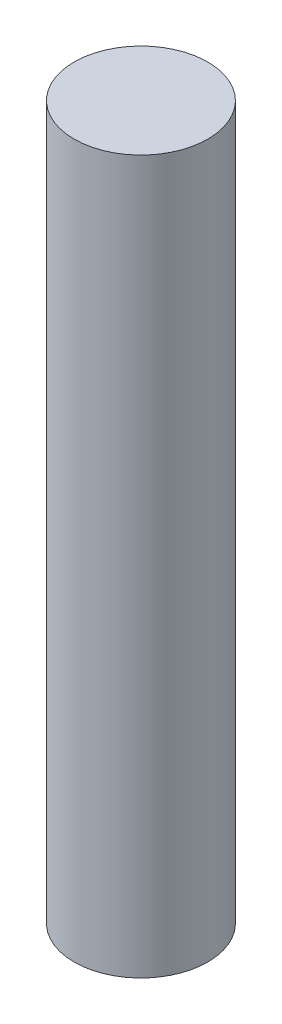
ISO-10303-21;
HEADER;
FILE_DESCRIPTION(('STEP AP214'),'2;1');
FILE_NAME('part.step','',(''),(''),'','','');
FILE_SCHEMA(('AUTOMOTIVE_DESIGN { 1 0 10303 214 1 1 1 1 }'));
ENDSEC;
DATA;
#1=APPLICATION_CONTEXT('core data for automotive mechanical design processes');
#2=APPLICATION_PROTOCOL_DEFINITION('international standard','automotive_design',2000,#1);
#3=PRODUCT_CONTEXT('',#1,'mechanical');
#4=PRODUCT('Part','Part','',(#3));
#5=PRODUCT_RELATED_PRODUCT_CATEGORY('part','',(#4));
#6=PRODUCT_DEFINITION_FORMATION('','',#4);
#7=PRODUCT_DEFINITION_CONTEXT('part definition',#1,'design');
#8=PRODUCT_DEFINITION('design','',#6,#7);
#9=PRODUCT_DEFINITION_SHAPE('','',#8);
#10=(LENGTH_UNIT() NAMED_UNIT(*) SI_UNIT(.MILLI.,.METRE.));
#11=(NAMED_UNIT(*) PLANE_ANGLE_UNIT() SI_UNIT($,.RADIAN.));
#12=(NAMED_UNIT(*) SI_UNIT($,.STERADIAN.) SOLID_ANGLE_UNIT());
#13=UNCERTAINTY_MEASURE_WITH_UNIT(LENGTH_MEASURE(1.E-05),#10,'distance_accuracy_value','');
#14=(GEOMETRIC_REPRESENTATION_CONTEXT(3) GLOBAL_UNCERTAINTY_ASSIGNED_CONTEXT((#13)) GLOBAL_UNIT_ASSIGNED_CONTEXT((#10,
#11,#12)) REPRESENTATION_CONTEXT('',''));
#15=CARTESIAN_POINT('',(0.,0.,0.));
#16=DIRECTION('',(0.,0.,1.));
#17=DIRECTION('',(1.,0.,0.));
#18=AXIS2_PLACEMENT_3D('',#15,#16,#17);
#19=CARTESIAN_POINT('',(0.,32.,0.));
#20=DIRECTION('',(0.,-1.,0.));
#21=DIRECTION('',(0.,0.,-1.));
#22=AXIS2_PLACEMENT_3D('',#19,#20,#21);
#23=CYLINDRICAL_SURFACE('',#22,3.);
#24=CARTESIAN_POINT('',(0.,32.,0.));
#25=DIRECTION('',(0.,1.,0.));
#26=DIRECTION('',(0.,0.,1.));
#27=AXIS2_PLACEMENT_3D('',#24,#25,#26);
#28=CIRCLE('',#27,3.);
#29=CARTESIAN_POINT('',(0.,32.,3.));
#30=VERTEX_POINT('',#29);
#31=EDGE_CURVE('E10',#30,#30,#28,.T.);
#32=ORIENTED_EDGE('',*,*,#31,.F.);
#33=EDGE_LOOP('',(#32));
#34=FACE_BOUND('',#33,.T.);
#35=CARTESIAN_POINT('',(0.,0.,0.));
#36=DIRECTION('',(0.,1.,0.));
#37=DIRECTION('',(0.,0.,1.));
#38=AXIS2_PLACEMENT_3D('',#35,#36,#37);
#39=CIRCLE('',#38,3.);
#40=CARTESIAN_POINT('',(0.,0.,3.));
#41=VERTEX_POINT('',#40);
#42=EDGE_CURVE('E34',#41,#41,#39,.T.);
#43=ORIENTED_EDGE('',*,*,#42,.T.);
#44=EDGE_LOOP('',(#43));
#45=FACE_BOUND('',#44,.T.);
#46=ADVANCED_FACE('F31',(#34,#45),#23,.T.);
#47=CARTESIAN_POINT('',(0.,32.,0.));
#48=DIRECTION('',(0.,1.,0.));
#49=DIRECTION('',(0.,0.,1.));
#50=AXIS2_PLACEMENT_3D('',#47,#48,#49);
#51=PLANE('',#50);
#52=ORIENTED_EDGE('',*,*,#31,.T.);
#53=EDGE_LOOP('',(#52));
#54=FACE_BOUND('',#53,.T.);
#55=ADVANCED_FACE('F46',(#54),#51,.T.);
#56=CARTESIAN_POINT('',(0.,0.,0.));
#57=DIRECTION('',(0.,1.,0.));
#58=DIRECTION('',(0.,0.,1.));
#59=AXIS2_PLACEMENT_3D('',#56,#57,#58);
#60=PLANE('',#59);
#61=ORIENTED_EDGE('',*,*,#42,.F.);
#62=EDGE_LOOP('',(#61));
#63=FACE_BOUND('',#62,.T.);
#64=ADVANCED_FACE('F44',(#63),#60,.F.);
#65=CLOSED_SHELL('',(#46,#55,#64));
#66=MANIFOLD_SOLID_BREP('B2',#65);
#67=ADVANCED_BREP_SHAPE_REPRESENTATION('',(#18,#66),#14);
#68=SHAPE_DEFINITION_REPRESENTATION(#9,#67);
ENDSEC;
END-ISO-10303-21;
